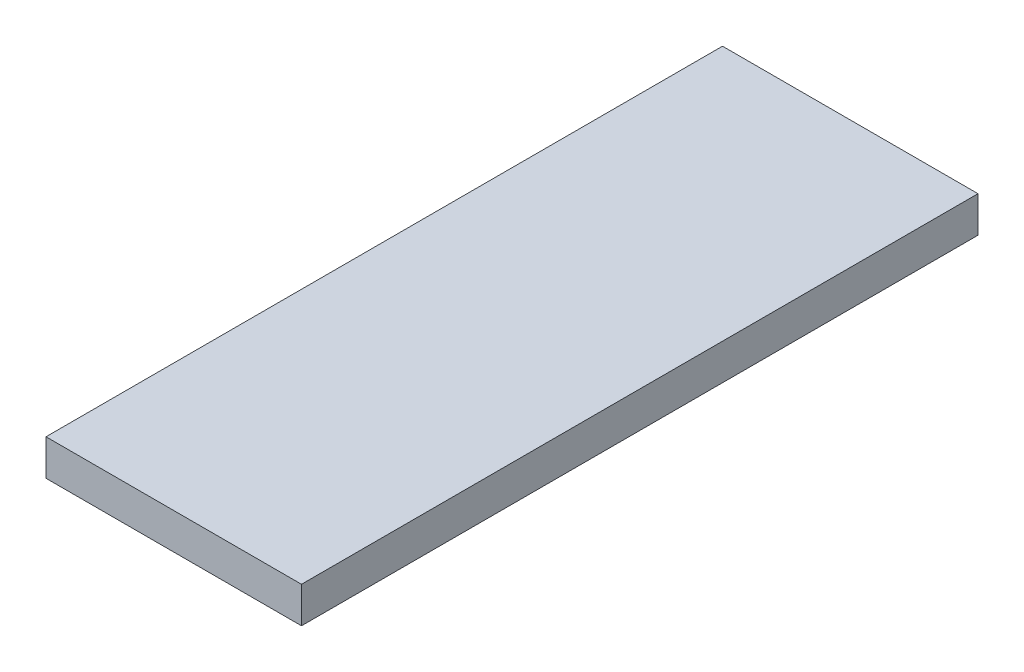
ISO-10303-21;
HEADER;
FILE_DESCRIPTION(('STEP AP214'),'2;1');
FILE_NAME('part.step','',(''),(''),'','','');
FILE_SCHEMA(('AUTOMOTIVE_DESIGN { 1 0 10303 214 1 1 1 1 }'));
ENDSEC;
DATA;
#1=APPLICATION_CONTEXT('core data for automotive mechanical design processes');
#2=APPLICATION_PROTOCOL_DEFINITION('international standard','automotive_design',2000,#1);
#3=PRODUCT_CONTEXT('',#1,'mechanical');
#4=PRODUCT('Part','Part','',(#3));
#5=PRODUCT_RELATED_PRODUCT_CATEGORY('part','',(#4));
#6=PRODUCT_DEFINITION_FORMATION('','',#4);
#7=PRODUCT_DEFINITION_CONTEXT('part definition',#1,'design');
#8=PRODUCT_DEFINITION('design','',#6,#7);
#9=PRODUCT_DEFINITION_SHAPE('','',#8);
#10=(LENGTH_UNIT() NAMED_UNIT(*) SI_UNIT(.MILLI.,.METRE.));
#11=(NAMED_UNIT(*) PLANE_ANGLE_UNIT() SI_UNIT($,.RADIAN.));
#12=(NAMED_UNIT(*) SI_UNIT($,.STERADIAN.) SOLID_ANGLE_UNIT());
#13=UNCERTAINTY_MEASURE_WITH_UNIT(LENGTH_MEASURE(1.E-05),#10,'distance_accuracy_value','');
#14=(GEOMETRIC_REPRESENTATION_CONTEXT(3) GLOBAL_UNCERTAINTY_ASSIGNED_CONTEXT((#13)) GLOBAL_UNIT_ASSIGNED_CONTEXT((#10,
#11,#12)) REPRESENTATION_CONTEXT('',''));
#15=CARTESIAN_POINT('',(0.,0.,0.));
#16=DIRECTION('',(0.,0.,1.));
#17=DIRECTION('',(1.,0.,0.));
#18=AXIS2_PLACEMENT_3D('',#15,#16,#17);
#19=CARTESIAN_POINT('',(0.,0.,940.));
#20=DIRECTION('',(1.,0.,0.));
#21=DIRECTION('',(0.,0.,-1.));
#22=AXIS2_PLACEMENT_3D('',#19,#20,#21);
#23=PLANE('',#22);
#24=DIRECTION('',(0.,-1.,0.));
#25=VECTOR('',#24,1.);
#26=CARTESIAN_POINT('',(0.,0.,0.));
#27=LINE('',#26,#25);
#28=CARTESIAN_POINT('',(0.,50.,0.));
#29=VERTEX_POINT('',#28);
#30=CARTESIAN_POINT('',(0.,0.,0.));
#31=VERTEX_POINT('',#30);
#32=EDGE_CURVE('E96',#29,#31,#27,.T.);
#33=ORIENTED_EDGE('',*,*,#32,.T.);
#34=DIRECTION('',(0.,0.,-1.));
#35=VECTOR('',#34,1.);
#36=CARTESIAN_POINT('',(0.,0.,940.));
#37=LINE('',#36,#35);
#38=CARTESIAN_POINT('',(0.,0.,940.));
#39=VERTEX_POINT('',#38);
#40=EDGE_CURVE('E11',#39,#31,#37,.T.);
#41=ORIENTED_EDGE('',*,*,#40,.F.);
#42=DIRECTION('',(0.,-1.,0.));
#43=VECTOR('',#42,1.);
#44=CARTESIAN_POINT('',(0.,0.,940.));
#45=LINE('',#44,#43);
#46=CARTESIAN_POINT('',(0.,50.,940.));
#47=VERTEX_POINT('',#46);
#48=EDGE_CURVE('E84',#47,#39,#45,.T.);
#49=ORIENTED_EDGE('',*,*,#48,.F.);
#50=DIRECTION('',(0.,0.,-1.));
#51=VECTOR('',#50,1.);
#52=CARTESIAN_POINT('',(0.,50.,940.));
#53=LINE('',#52,#51);
#54=EDGE_CURVE('E92',#47,#29,#53,.T.);
#55=ORIENTED_EDGE('',*,*,#54,.T.);
#56=EDGE_LOOP('',(#33,#41,#49,#55));
#57=FACE_BOUND('',#56,.T.);
#58=ADVANCED_FACE('F33',(#57),#23,.F.);
#59=CARTESIAN_POINT('',(0.,0.,940.));
#60=DIRECTION('',(0.,1.,0.));
#61=DIRECTION('',(0.,0.,1.));
#62=AXIS2_PLACEMENT_3D('',#59,#60,#61);
#63=PLANE('',#62);
#64=DIRECTION('',(1.,0.,0.));
#65=VECTOR('',#64,1.);
#66=CARTESIAN_POINT('',(0.,0.,0.));
#67=LINE('',#66,#65);
#68=CARTESIAN_POINT('',(355.,0.,0.));
#69=VERTEX_POINT('',#68);
#70=EDGE_CURVE('E88',#31,#69,#67,.T.);
#71=ORIENTED_EDGE('',*,*,#70,.T.);
#72=DIRECTION('',(0.,0.,-1.));
#73=VECTOR('',#72,1.);
#74=CARTESIAN_POINT('',(355.,0.,940.));
#75=LINE('',#74,#73);
#76=CARTESIAN_POINT('',(355.,0.,940.));
#77=VERTEX_POINT('',#76);
#78=EDGE_CURVE('E41',#77,#69,#75,.T.);
#79=ORIENTED_EDGE('',*,*,#78,.F.);
#80=DIRECTION('',(1.,0.,0.));
#81=VECTOR('',#80,1.);
#82=CARTESIAN_POINT('',(0.,0.,940.));
#83=LINE('',#82,#81);
#84=EDGE_CURVE('E79',#39,#77,#83,.T.);
#85=ORIENTED_EDGE('',*,*,#84,.F.);
#86=ORIENTED_EDGE('',*,*,#40,.T.);
#87=EDGE_LOOP('',(#71,#79,#85,#86));
#88=FACE_BOUND('',#87,.T.);
#89=ADVANCED_FACE('F87',(#88),#63,.F.);
#90=CARTESIAN_POINT('',(355.,0.,940.));
#91=DIRECTION('',(-1.,0.,0.));
#92=DIRECTION('',(0.,0.,1.));
#93=AXIS2_PLACEMENT_3D('',#90,#91,#92);
#94=PLANE('',#93);
#95=DIRECTION('',(0.,1.,0.));
#96=VECTOR('',#95,1.);
#97=CARTESIAN_POINT('',(355.,0.,0.));
#98=LINE('',#97,#96);
#99=CARTESIAN_POINT('',(355.,50.,0.));
#100=VERTEX_POINT('',#99);
#101=EDGE_CURVE('E66',#69,#100,#98,.T.);
#102=ORIENTED_EDGE('',*,*,#101,.T.);
#103=DIRECTION('',(0.,0.,-1.));
#104=VECTOR('',#103,1.);
#105=CARTESIAN_POINT('',(355.,50.,940.));
#106=LINE('',#105,#104);
#107=CARTESIAN_POINT('',(355.,50.,940.));
#108=VERTEX_POINT('',#107);
#109=EDGE_CURVE('E89',#108,#100,#106,.T.);
#110=ORIENTED_EDGE('',*,*,#109,.F.);
#111=DIRECTION('',(0.,1.,0.));
#112=VECTOR('',#111,1.);
#113=CARTESIAN_POINT('',(355.,0.,940.));
#114=LINE('',#113,#112);
#115=EDGE_CURVE('E82',#77,#108,#114,.T.);
#116=ORIENTED_EDGE('',*,*,#115,.F.);
#117=ORIENTED_EDGE('',*,*,#78,.T.);
#118=EDGE_LOOP('',(#102,#110,#116,#117));
#119=FACE_BOUND('',#118,.T.);
#120=ADVANCED_FACE('F90',(#119),#94,.F.);
#121=CARTESIAN_POINT('',(0.,50.,940.));
#122=DIRECTION('',(0.,-1.,0.));
#123=DIRECTION('',(0.,0.,-1.));
#124=AXIS2_PLACEMENT_3D('',#121,#122,#123);
#125=PLANE('',#124);
#126=DIRECTION('',(-1.,0.,0.));
#127=VECTOR('',#126,1.);
#128=CARTESIAN_POINT('',(0.,50.,0.));
#129=LINE('',#128,#127);
#130=EDGE_CURVE('E72',#100,#29,#129,.T.);
#131=ORIENTED_EDGE('',*,*,#130,.T.);
#132=ORIENTED_EDGE('',*,*,#54,.F.);
#133=DIRECTION('',(-1.,0.,0.));
#134=VECTOR('',#133,1.);
#135=CARTESIAN_POINT('',(0.,50.,940.));
#136=LINE('',#135,#134);
#137=EDGE_CURVE('E49',#108,#47,#136,.T.);
#138=ORIENTED_EDGE('',*,*,#137,.F.);
#139=ORIENTED_EDGE('',*,*,#109,.T.);
#140=EDGE_LOOP('',(#131,#132,#138,#139));
#141=FACE_BOUND('',#140,.T.);
#142=ADVANCED_FACE('F103',(#141),#125,.F.);
#143=CARTESIAN_POINT('',(0.,0.,940.));
#144=DIRECTION('',(0.,0.,-1.));
#145=DIRECTION('',(-1.,0.,0.));
#146=AXIS2_PLACEMENT_3D('',#143,#144,#145);
#147=PLANE('',#146);
#148=ORIENTED_EDGE('',*,*,#48,.T.);
#149=ORIENTED_EDGE('',*,*,#84,.T.);
#150=ORIENTED_EDGE('',*,*,#115,.T.);
#151=ORIENTED_EDGE('',*,*,#137,.T.);
#152=EDGE_LOOP('',(#148,#149,#150,#151));
#153=FACE_BOUND('',#152,.T.);
#154=ADVANCED_FACE('F80',(#153),#147,.F.);
#155=CARTESIAN_POINT('',(0.,0.,0.));
#156=DIRECTION('',(0.,0.,-1.));
#157=DIRECTION('',(-1.,0.,0.));
#158=AXIS2_PLACEMENT_3D('',#155,#156,#157);
#159=PLANE('',#158);
#160=ORIENTED_EDGE('',*,*,#32,.F.);
#161=ORIENTED_EDGE('',*,*,#130,.F.);
#162=ORIENTED_EDGE('',*,*,#101,.F.);
#163=ORIENTED_EDGE('',*,*,#70,.F.);
#164=EDGE_LOOP('',(#160,#161,#162,#163));
#165=FACE_BOUND('',#164,.T.);
#166=ADVANCED_FACE('F106',(#165),#159,.T.);
#167=CLOSED_SHELL('',(#58,#89,#120,#142,#154,#166));
#168=MANIFOLD_SOLID_BREP('B2',#167);
#169=ADVANCED_BREP_SHAPE_REPRESENTATION('',(#18,#168),#14);
#170=SHAPE_DEFINITION_REPRESENTATION(#9,#169);
ENDSEC;
END-ISO-10303-21;
